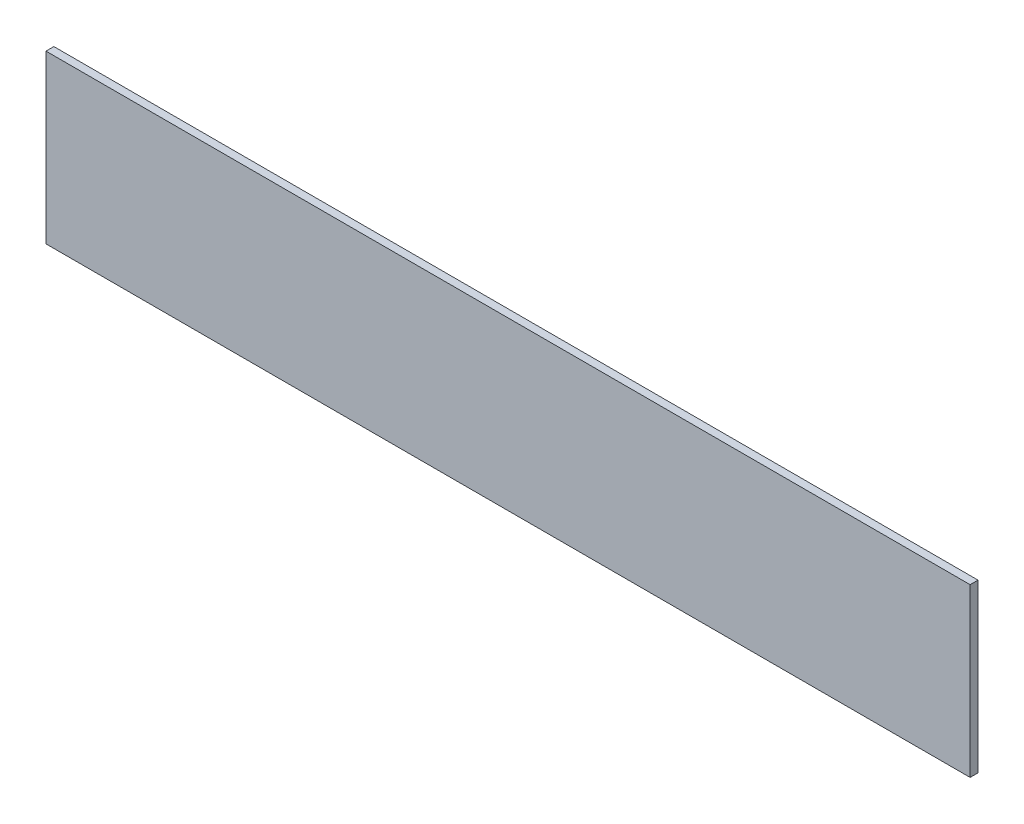
ISO-10303-21;
HEADER;
FILE_DESCRIPTION(('STEP AP214'),'2;1');
FILE_NAME('part.step','',(''),(''),'','','');
FILE_SCHEMA(('AUTOMOTIVE_DESIGN { 1 0 10303 214 1 1 1 1 }'));
ENDSEC;
DATA;
#1=APPLICATION_CONTEXT('core data for automotive mechanical design processes');
#2=APPLICATION_PROTOCOL_DEFINITION('international standard','automotive_design',2000,#1);
#3=PRODUCT_CONTEXT('',#1,'mechanical');
#4=PRODUCT('Part','Part','',(#3));
#5=PRODUCT_RELATED_PRODUCT_CATEGORY('part','',(#4));
#6=PRODUCT_DEFINITION_FORMATION('','',#4);
#7=PRODUCT_DEFINITION_CONTEXT('part definition',#1,'design');
#8=PRODUCT_DEFINITION('design','',#6,#7);
#9=PRODUCT_DEFINITION_SHAPE('','',#8);
#10=(LENGTH_UNIT() NAMED_UNIT(*) SI_UNIT(.MILLI.,.METRE.));
#11=(NAMED_UNIT(*) PLANE_ANGLE_UNIT() SI_UNIT($,.RADIAN.));
#12=(NAMED_UNIT(*) SI_UNIT($,.STERADIAN.) SOLID_ANGLE_UNIT());
#13=UNCERTAINTY_MEASURE_WITH_UNIT(LENGTH_MEASURE(1.E-05),#10,'distance_accuracy_value','');
#14=(GEOMETRIC_REPRESENTATION_CONTEXT(3) GLOBAL_UNCERTAINTY_ASSIGNED_CONTEXT((#13)) GLOBAL_UNIT_ASSIGNED_CONTEXT((#10,
#11,#12)) REPRESENTATION_CONTEXT('',''));
#15=CARTESIAN_POINT('',(0.,0.,0.));
#16=DIRECTION('',(0.,0.,1.));
#17=DIRECTION('',(1.,0.,0.));
#18=AXIS2_PLACEMENT_3D('',#15,#16,#17);
#19=CARTESIAN_POINT('',(-1.4210854715202E-13,0.,3.));
#20=DIRECTION('',(0.,0.,1.));
#21=DIRECTION('',(1.,0.,0.));
#22=AXIS2_PLACEMENT_3D('',#19,#20,#21);
#23=PLANE('',#22);
#24=DIRECTION('',(-1.,0.,0.));
#25=VECTOR('',#24,1.);
#26=CARTESIAN_POINT('',(-351.5,63.5,3.));
#27=LINE('',#26,#25);
#28=CARTESIAN_POINT('',(351.5,63.5,3.));
#29=VERTEX_POINT('',#28);
#30=CARTESIAN_POINT('',(-351.5,63.5,3.));
#31=VERTEX_POINT('',#30);
#32=EDGE_CURVE('E10',#29,#31,#27,.T.);
#33=ORIENTED_EDGE('',*,*,#32,.T.);
#34=DIRECTION('',(0.,-1.,0.));
#35=VECTOR('',#34,1.);
#36=CARTESIAN_POINT('',(-351.5,-63.5,3.));
#37=LINE('',#36,#35);
#38=CARTESIAN_POINT('',(-351.5,-63.5,3.));
#39=VERTEX_POINT('',#38);
#40=EDGE_CURVE('E20',#31,#39,#37,.T.);
#41=ORIENTED_EDGE('',*,*,#40,.T.);
#42=DIRECTION('',(1.,0.,0.));
#43=VECTOR('',#42,1.);
#44=CARTESIAN_POINT('',(351.5,-63.5,3.));
#45=LINE('',#44,#43);
#46=CARTESIAN_POINT('',(351.5,-63.5,3.));
#47=VERTEX_POINT('',#46);
#48=EDGE_CURVE('E90',#39,#47,#45,.T.);
#49=ORIENTED_EDGE('',*,*,#48,.T.);
#50=DIRECTION('',(0.,1.,0.));
#51=VECTOR('',#50,1.);
#52=CARTESIAN_POINT('',(351.5,63.5,3.));
#53=LINE('',#52,#51);
#54=EDGE_CURVE('E85',#47,#29,#53,.T.);
#55=ORIENTED_EDGE('',*,*,#54,.T.);
#56=EDGE_LOOP('',(#33,#41,#49,#55));
#57=FACE_BOUND('',#56,.T.);
#58=ADVANCED_FACE('F16',(#57),#23,.T.);
#59=CARTESIAN_POINT('',(351.5,63.5,0.));
#60=DIRECTION('',(0.,1.,0.));
#61=DIRECTION('',(-1.,0.,0.));
#62=AXIS2_PLACEMENT_3D('',#59,#60,#61);
#63=PLANE('',#62);
#64=DIRECTION('',(0.,0.,1.));
#65=VECTOR('',#64,1.);
#66=CARTESIAN_POINT('',(-351.5,63.5,0.));
#67=LINE('',#66,#65);
#68=CARTESIAN_POINT('',(-351.5,63.5,-3.));
#69=VERTEX_POINT('',#68);
#70=EDGE_CURVE('E26',#69,#31,#67,.T.);
#71=ORIENTED_EDGE('',*,*,#70,.T.);
#72=ORIENTED_EDGE('',*,*,#32,.F.);
#73=DIRECTION('',(0.,0.,-1.));
#74=VECTOR('',#73,1.);
#75=CARTESIAN_POINT('',(351.5,63.5,0.));
#76=LINE('',#75,#74);
#77=CARTESIAN_POINT('',(351.5,63.5,-3.));
#78=VERTEX_POINT('',#77);
#79=EDGE_CURVE('E71',#29,#78,#76,.T.);
#80=ORIENTED_EDGE('',*,*,#79,.T.);
#81=DIRECTION('',(1.,0.,0.));
#82=VECTOR('',#81,1.);
#83=CARTESIAN_POINT('',(-351.5,63.5,-3.));
#84=LINE('',#83,#82);
#85=EDGE_CURVE('E67',#69,#78,#84,.T.);
#86=ORIENTED_EDGE('',*,*,#85,.F.);
#87=EDGE_LOOP('',(#71,#72,#80,#86));
#88=FACE_BOUND('',#87,.T.);
#89=ADVANCED_FACE('F73',(#88),#63,.T.);
#90=CARTESIAN_POINT('',(-351.5,63.5,0.));
#91=DIRECTION('',(-1.,0.,0.));
#92=DIRECTION('',(0.,-1.,0.));
#93=AXIS2_PLACEMENT_3D('',#90,#91,#92);
#94=PLANE('',#93);
#95=DIRECTION('',(0.,0.,-1.));
#96=VECTOR('',#95,1.);
#97=CARTESIAN_POINT('',(-351.5,-63.5,0.));
#98=LINE('',#97,#96);
#99=CARTESIAN_POINT('',(-351.5,-63.5,-3.));
#100=VERTEX_POINT('',#99);
#101=EDGE_CURVE('E93',#39,#100,#98,.T.);
#102=ORIENTED_EDGE('',*,*,#101,.F.);
#103=ORIENTED_EDGE('',*,*,#40,.F.);
#104=ORIENTED_EDGE('',*,*,#70,.F.);
#105=DIRECTION('',(0.,1.,0.));
#106=VECTOR('',#105,1.);
#107=CARTESIAN_POINT('',(-351.5,-63.5,-3.));
#108=LINE('',#107,#106);
#109=EDGE_CURVE('E57',#100,#69,#108,.T.);
#110=ORIENTED_EDGE('',*,*,#109,.F.);
#111=EDGE_LOOP('',(#102,#103,#104,#110));
#112=FACE_BOUND('',#111,.T.);
#113=ADVANCED_FACE('F56',(#112),#94,.T.);
#114=CARTESIAN_POINT('',(-351.5,-63.5,0.));
#115=DIRECTION('',(0.,-1.,0.));
#116=DIRECTION('',(1.,0.,0.));
#117=AXIS2_PLACEMENT_3D('',#114,#115,#116);
#118=PLANE('',#117);
#119=DIRECTION('',(0.,0.,-1.));
#120=VECTOR('',#119,1.);
#121=CARTESIAN_POINT('',(351.5,-63.5,0.));
#122=LINE('',#121,#120);
#123=CARTESIAN_POINT('',(351.5,-63.5,-3.));
#124=VERTEX_POINT('',#123);
#125=EDGE_CURVE('E86',#47,#124,#122,.T.);
#126=ORIENTED_EDGE('',*,*,#125,.F.);
#127=ORIENTED_EDGE('',*,*,#48,.F.);
#128=ORIENTED_EDGE('',*,*,#101,.T.);
#129=DIRECTION('',(-1.,0.,0.));
#130=VECTOR('',#129,1.);
#131=CARTESIAN_POINT('',(351.5,-63.5,-3.));
#132=LINE('',#131,#130);
#133=EDGE_CURVE('E69',#124,#100,#132,.T.);
#134=ORIENTED_EDGE('',*,*,#133,.F.);
#135=EDGE_LOOP('',(#126,#127,#128,#134));
#136=FACE_BOUND('',#135,.T.);
#137=ADVANCED_FACE('F115',(#136),#118,.T.);
#138=CARTESIAN_POINT('',(351.5,-63.5,0.));
#139=DIRECTION('',(1.,0.,0.));
#140=DIRECTION('',(0.,1.,0.));
#141=AXIS2_PLACEMENT_3D('',#138,#139,#140);
#142=PLANE('',#141);
#143=ORIENTED_EDGE('',*,*,#79,.F.);
#144=ORIENTED_EDGE('',*,*,#54,.F.);
#145=ORIENTED_EDGE('',*,*,#125,.T.);
#146=DIRECTION('',(0.,-1.,0.));
#147=VECTOR('',#146,1.);
#148=CARTESIAN_POINT('',(351.5,63.5,-3.));
#149=LINE('',#148,#147);
#150=EDGE_CURVE('E77',#78,#124,#149,.T.);
#151=ORIENTED_EDGE('',*,*,#150,.F.);
#152=EDGE_LOOP('',(#143,#144,#145,#151));
#153=FACE_BOUND('',#152,.T.);
#154=ADVANCED_FACE('F18',(#153),#142,.T.);
#155=CARTESIAN_POINT('',(-1.4210854715202E-13,0.,-3.));
#156=DIRECTION('',(0.,0.,-1.));
#157=DIRECTION('',(-1.,0.,0.));
#158=AXIS2_PLACEMENT_3D('',#155,#156,#157);
#159=PLANE('',#158);
#160=ORIENTED_EDGE('',*,*,#85,.T.);
#161=ORIENTED_EDGE('',*,*,#150,.T.);
#162=ORIENTED_EDGE('',*,*,#133,.T.);
#163=ORIENTED_EDGE('',*,*,#109,.T.);
#164=EDGE_LOOP('',(#160,#161,#162,#163));
#165=FACE_BOUND('',#164,.T.);
#166=ADVANCED_FACE('F65',(#165),#159,.T.);
#167=CLOSED_SHELL('',(#58,#89,#113,#137,#154,#166));
#168=MANIFOLD_SOLID_BREP('B1',#167);
#169=ADVANCED_BREP_SHAPE_REPRESENTATION('',(#18,#168),#14);
#170=SHAPE_DEFINITION_REPRESENTATION(#9,#169);
ENDSEC;
END-ISO-10303-21;
